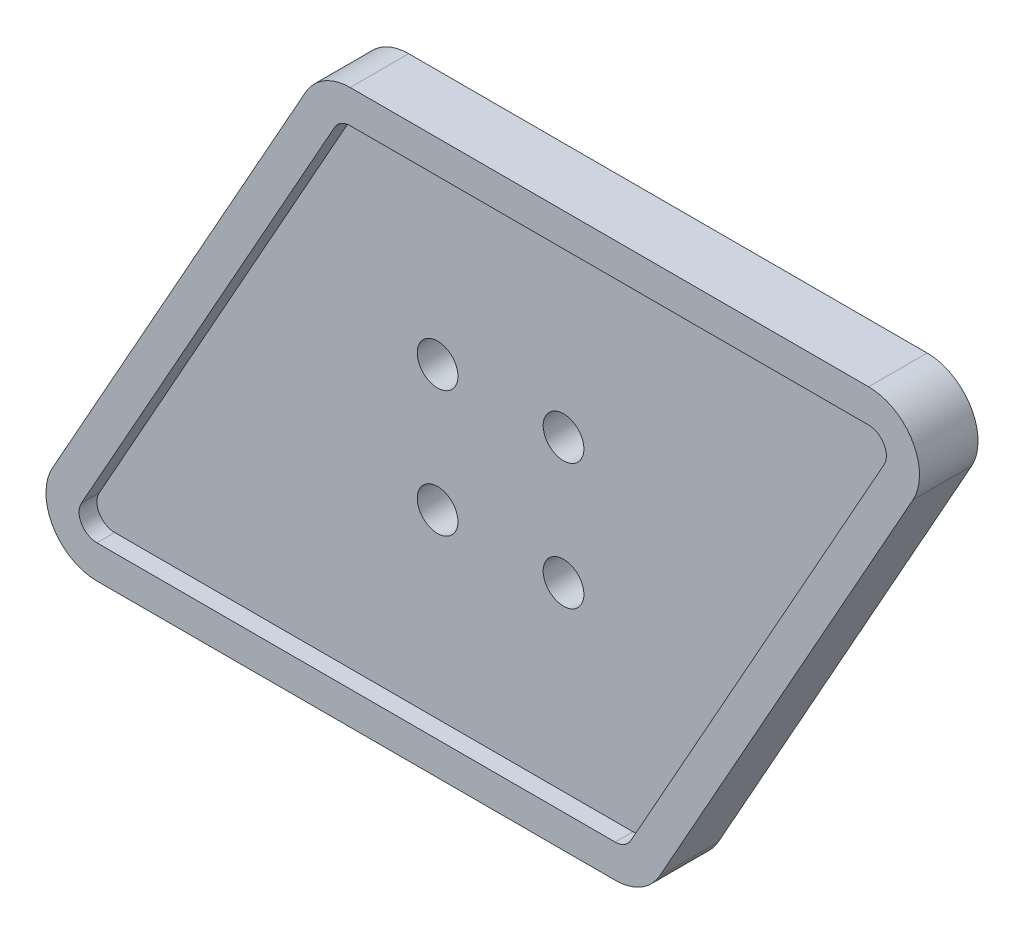
ISO-10303-21;
HEADER;
FILE_DESCRIPTION(('STEP AP214'),'2;1');
FILE_NAME('part.step','',(''),(''),'','','');
FILE_SCHEMA(('AUTOMOTIVE_DESIGN { 1 0 10303 214 1 1 1 1 }'));
ENDSEC;
DATA;
#1=APPLICATION_CONTEXT('core data for automotive mechanical design processes');
#2=APPLICATION_PROTOCOL_DEFINITION('international standard','automotive_design',2000,#1);
#3=PRODUCT_CONTEXT('',#1,'mechanical');
#4=PRODUCT('Part','Part','',(#3));
#5=PRODUCT_RELATED_PRODUCT_CATEGORY('part','',(#4));
#6=PRODUCT_DEFINITION_FORMATION('','',#4);
#7=PRODUCT_DEFINITION_CONTEXT('part definition',#1,'design');
#8=PRODUCT_DEFINITION('design','',#6,#7);
#9=PRODUCT_DEFINITION_SHAPE('','',#8);
#10=(LENGTH_UNIT() NAMED_UNIT(*) SI_UNIT(.MILLI.,.METRE.));
#11=(NAMED_UNIT(*) PLANE_ANGLE_UNIT() SI_UNIT($,.RADIAN.));
#12=(NAMED_UNIT(*) SI_UNIT($,.STERADIAN.) SOLID_ANGLE_UNIT());
#13=UNCERTAINTY_MEASURE_WITH_UNIT(LENGTH_MEASURE(1.E-05),#10,'distance_accuracy_value','');
#14=(GEOMETRIC_REPRESENTATION_CONTEXT(3) GLOBAL_UNCERTAINTY_ASSIGNED_CONTEXT((#13)) GLOBAL_UNIT_ASSIGNED_CONTEXT((#10,
#11,#12)) REPRESENTATION_CONTEXT('',''));
#15=CARTESIAN_POINT('',(0.,0.,0.));
#16=DIRECTION('',(0.,0.,1.));
#17=DIRECTION('',(1.,0.,0.));
#18=AXIS2_PLACEMENT_3D('',#15,#16,#17);
#19=CARTESIAN_POINT('',(-4.94974746830583,4.94974746830583,4.6));
#20=DIRECTION('',(0.,0.,-1.));
#21=DIRECTION('',(-1.,0.,0.));
#22=AXIS2_PLACEMENT_3D('',#19,#20,#21);
#23=CYLINDRICAL_SURFACE('',#22,1.6);
#24=CARTESIAN_POINT('',(-4.94974746830583,4.94974746830583,0.));
#25=DIRECTION('',(0.,0.,1.));
#26=DIRECTION('',(1.,0.,0.));
#27=AXIS2_PLACEMENT_3D('',#24,#25,#26);
#28=CIRCLE('',#27,1.6);
#29=CARTESIAN_POINT('',(-3.34974746830583,4.94974746830583,0.));
#30=VERTEX_POINT('',#29);
#31=EDGE_CURVE('E147',#30,#30,#28,.T.);
#32=ORIENTED_EDGE('',*,*,#31,.F.);
#33=EDGE_LOOP('',(#32));
#34=FACE_BOUND('',#33,.T.);
#35=CARTESIAN_POINT('',(-4.94974746830583,4.94974746830583,3.2));
#36=DIRECTION('',(0.,0.,1.));
#37=DIRECTION('',(1.,0.,0.));
#38=AXIS2_PLACEMENT_3D('',#35,#36,#37);
#39=CIRCLE('',#38,1.6);
#40=CARTESIAN_POINT('',(-3.34974746830583,4.94974746830583,3.2));
#41=VERTEX_POINT('',#40);
#42=EDGE_CURVE('E205',#41,#41,#39,.T.);
#43=ORIENTED_EDGE('',*,*,#42,.T.);
#44=EDGE_LOOP('',(#43));
#45=FACE_BOUND('',#44,.T.);
#46=ADVANCED_FACE('F33',(#34,#45),#23,.F.);
#47=CARTESIAN_POINT('',(4.94974746830583,4.94974746830583,4.6));
#48=DIRECTION('',(0.,0.,-1.));
#49=DIRECTION('',(-1.,0.,0.));
#50=AXIS2_PLACEMENT_3D('',#47,#48,#49);
#51=CYLINDRICAL_SURFACE('',#50,1.6);
#52=CARTESIAN_POINT('',(4.94974746830583,4.94974746830583,0.));
#53=DIRECTION('',(0.,0.,1.));
#54=DIRECTION('',(1.,0.,0.));
#55=AXIS2_PLACEMENT_3D('',#52,#53,#54);
#56=CIRCLE('',#55,1.6);
#57=CARTESIAN_POINT('',(6.54974746830583,4.94974746830583,0.));
#58=VERTEX_POINT('',#57);
#59=EDGE_CURVE('E196',#58,#58,#56,.T.);
#60=ORIENTED_EDGE('',*,*,#59,.F.);
#61=EDGE_LOOP('',(#60));
#62=FACE_BOUND('',#61,.T.);
#63=CARTESIAN_POINT('',(4.94974746830583,4.94974746830583,3.2));
#64=DIRECTION('',(0.,0.,1.));
#65=DIRECTION('',(1.,0.,0.));
#66=AXIS2_PLACEMENT_3D('',#63,#64,#65);
#67=CIRCLE('',#66,1.6);
#68=CARTESIAN_POINT('',(6.54974746830583,4.94974746830583,3.2));
#69=VERTEX_POINT('',#68);
#70=EDGE_CURVE('E208',#69,#69,#67,.T.);
#71=ORIENTED_EDGE('',*,*,#70,.T.);
#72=EDGE_LOOP('',(#71));
#73=FACE_BOUND('',#72,.T.);
#74=ADVANCED_FACE('F356',(#62,#73),#51,.F.);
#75=CARTESIAN_POINT('',(4.94974746830583,-4.94974746830583,4.6));
#76=DIRECTION('',(0.,0.,-1.));
#77=DIRECTION('',(-1.,0.,0.));
#78=AXIS2_PLACEMENT_3D('',#75,#76,#77);
#79=CYLINDRICAL_SURFACE('',#78,1.6);
#80=CARTESIAN_POINT('',(4.94974746830583,-4.94974746830583,0.));
#81=DIRECTION('',(0.,0.,1.));
#82=DIRECTION('',(1.,0.,0.));
#83=AXIS2_PLACEMENT_3D('',#80,#81,#82);
#84=CIRCLE('',#83,1.6);
#85=CARTESIAN_POINT('',(6.54974746830583,-4.94974746830583,0.));
#86=VERTEX_POINT('',#85);
#87=EDGE_CURVE('E199',#86,#86,#84,.T.);
#88=ORIENTED_EDGE('',*,*,#87,.F.);
#89=EDGE_LOOP('',(#88));
#90=FACE_BOUND('',#89,.T.);
#91=CARTESIAN_POINT('',(4.94974746830583,-4.94974746830583,3.2));
#92=DIRECTION('',(0.,0.,1.));
#93=DIRECTION('',(1.,0.,0.));
#94=AXIS2_PLACEMENT_3D('',#91,#92,#93);
#95=CIRCLE('',#94,1.6);
#96=CARTESIAN_POINT('',(6.54974746830583,-4.94974746830583,3.2));
#97=VERTEX_POINT('',#96);
#98=EDGE_CURVE('E211',#97,#97,#95,.T.);
#99=ORIENTED_EDGE('',*,*,#98,.T.);
#100=EDGE_LOOP('',(#99));
#101=FACE_BOUND('',#100,.T.);
#102=ADVANCED_FACE('F362',(#90,#101),#79,.F.);
#103=CARTESIAN_POINT('',(-4.94974746830583,-4.94974746830583,4.6));
#104=DIRECTION('',(0.,0.,-1.));
#105=DIRECTION('',(-1.,0.,0.));
#106=AXIS2_PLACEMENT_3D('',#103,#104,#105);
#107=CYLINDRICAL_SURFACE('',#106,1.6);
#108=CARTESIAN_POINT('',(-4.94974746830583,-4.94974746830583,0.));
#109=DIRECTION('',(0.,0.,1.));
#110=DIRECTION('',(1.,0.,0.));
#111=AXIS2_PLACEMENT_3D('',#108,#109,#110);
#112=CIRCLE('',#111,1.6);
#113=CARTESIAN_POINT('',(-3.34974746830583,-4.94974746830583,0.));
#114=VERTEX_POINT('',#113);
#115=EDGE_CURVE('E202',#114,#114,#112,.T.);
#116=ORIENTED_EDGE('',*,*,#115,.F.);
#117=EDGE_LOOP('',(#116));
#118=FACE_BOUND('',#117,.T.);
#119=CARTESIAN_POINT('',(-4.94974746830583,-4.94974746830583,3.2));
#120=DIRECTION('',(0.,0.,1.));
#121=DIRECTION('',(1.,0.,0.));
#122=AXIS2_PLACEMENT_3D('',#119,#120,#121);
#123=CIRCLE('',#122,1.6);
#124=CARTESIAN_POINT('',(-3.34974746830583,-4.94974746830583,3.2));
#125=VERTEX_POINT('',#124);
#126=EDGE_CURVE('E37',#125,#125,#123,.T.);
#127=ORIENTED_EDGE('',*,*,#126,.T.);
#128=EDGE_LOOP('',(#127));
#129=FACE_BOUND('',#128,.T.);
#130=ADVANCED_FACE('F371',(#118,#129),#107,.F.);
#131=CARTESIAN_POINT('',(10.4158751990318,-17.7727190896102,4.6));
#132=DIRECTION('',(0.,0.,-1.));
#133=DIRECTION('',(-1.,0.,0.));
#134=AXIS2_PLACEMENT_3D('',#131,#132,#133);
#135=PLANE('',#134);
#136=DIRECTION('',(0.488686699209131,0.872459345766944,0.));
#137=VECTOR('',#136,1.);
#138=CARTESIAN_POINT('',(11.6373182831056,-18.456880468503,4.6));
#139=LINE('',#138,#137);
#140=CARTESIAN_POINT('',(11.6373182831056,-18.456880468503,4.6));
#141=VERTEX_POINT('',#140);
#142=CARTESIAN_POINT('',(31.5472234724134,17.0885577107174,4.6));
#143=VERTEX_POINT('',#142);
#144=EDGE_CURVE('E256',#141,#143,#139,.T.);
#145=ORIENTED_EDGE('',*,*,#144,.F.);
#146=CARTESIAN_POINT('',(10.4158751990318,-17.7727190896102,4.6));
#147=DIRECTION('',(0.,0.,1.));
#148=DIRECTION('',(1.,0.,0.));
#149=AXIS2_PLACEMENT_3D('',#146,#147,#148);
#150=CIRCLE('',#149,1.40000000000001);
#151=CARTESIAN_POINT('',(10.4158751990318,-19.1727190896102,4.6));
#152=VERTEX_POINT('',#151);
#153=EDGE_CURVE('E49',#152,#141,#150,.T.);
#154=ORIENTED_EDGE('',*,*,#153,.F.);
#155=DIRECTION('',(1.,0.,0.));
#156=VECTOR('',#155,1.);
#157=CARTESIAN_POINT('',(-30.3257803883397,-19.1727190896102,4.6));
#158=LINE('',#157,#156);
#159=CARTESIAN_POINT('',(-30.3257803883397,-19.1727190896102,4.6));
#160=VERTEX_POINT('',#159);
#161=EDGE_CURVE('E237',#160,#152,#158,.T.);
#162=ORIENTED_EDGE('',*,*,#161,.F.);
#163=CARTESIAN_POINT('',(-30.3257803883397,-17.7727190896102,4.6));
#164=DIRECTION('',(0.,0.,1.));
#165=DIRECTION('',(1.,0.,0.));
#166=AXIS2_PLACEMENT_3D('',#163,#164,#165);
#167=CIRCLE('',#166,1.40000000000003);
#168=CARTESIAN_POINT('',(-31.5472234724134,-17.0885577107174,4.6));
#169=VERTEX_POINT('',#168);
#170=EDGE_CURVE('E241',#169,#160,#167,.T.);
#171=ORIENTED_EDGE('',*,*,#170,.F.);
#172=DIRECTION('',(-0.488686699209131,-0.872459345766944,0.));
#173=VECTOR('',#172,1.);
#174=CARTESIAN_POINT('',(-11.6373182831056,18.4568804685029,4.6));
#175=LINE('',#174,#173);
#176=CARTESIAN_POINT('',(-11.6373182831056,18.4568804685029,4.6));
#177=VERTEX_POINT('',#176);
#178=EDGE_CURVE('E244',#177,#169,#175,.T.);
#179=ORIENTED_EDGE('',*,*,#178,.F.);
#180=CARTESIAN_POINT('',(-10.4158751990318,17.7727190896102,4.6));
#181=DIRECTION('',(0.,0.,1.));
#182=DIRECTION('',(1.,0.,0.));
#183=AXIS2_PLACEMENT_3D('',#180,#181,#182);
#184=CIRCLE('',#183,1.40000000000001);
#185=CARTESIAN_POINT('',(-10.4158751990319,19.1727190896102,4.6));
#186=VERTEX_POINT('',#185);
#187=EDGE_CURVE('E247',#186,#177,#184,.T.);
#188=ORIENTED_EDGE('',*,*,#187,.F.);
#189=DIRECTION('',(-1.,0.,0.));
#190=VECTOR('',#189,1.);
#191=CARTESIAN_POINT('',(30.3257803883397,19.1727190896102,4.6));
#192=LINE('',#191,#190);
#193=CARTESIAN_POINT('',(30.3257803883397,19.1727190896102,4.6));
#194=VERTEX_POINT('',#193);
#195=EDGE_CURVE('E250',#194,#186,#192,.T.);
#196=ORIENTED_EDGE('',*,*,#195,.F.);
#197=CARTESIAN_POINT('',(30.3257803883396,17.7727190896101,4.6));
#198=DIRECTION('',(0.,0.,1.));
#199=DIRECTION('',(1.,0.,0.));
#200=AXIS2_PLACEMENT_3D('',#197,#198,#199);
#201=CIRCLE('',#200,1.40000000000003);
#202=EDGE_CURVE('E253',#143,#194,#201,.T.);
#203=ORIENTED_EDGE('',*,*,#202,.F.);
#204=EDGE_LOOP('',(#145,#154,#162,#171,#179,#188,#196,#203));
#205=FACE_BOUND('',#204,.T.);
#206=CARTESIAN_POINT('',(10.4158751990318,-17.7727190896102,4.6));
#207=DIRECTION('',(0.,0.,1.));
#208=DIRECTION('',(-1.,0.,0.));
#209=AXIS2_PLACEMENT_3D('',#206,#207,#208);
#210=CIRCLE('',#209,4.00000000000001);
#211=CARTESIAN_POINT('',(10.4158751990318,-21.7727190896102,4.6));
#212=VERTEX_POINT('',#211);
#213=CARTESIAN_POINT('',(13.9057125820996,-19.7274658864467,4.6));
#214=VERTEX_POINT('',#213);
#215=EDGE_CURVE('E159',#212,#214,#210,.T.);
#216=ORIENTED_EDGE('',*,*,#215,.T.);
#217=DIRECTION('',(0.488686699209131,0.872459345766944,0.));
#218=VECTOR('',#217,1.);
#219=CARTESIAN_POINT('',(33.8156177714075,15.8179722927736,4.6));
#220=LINE('',#219,#218);
#221=CARTESIAN_POINT('',(33.8156177714075,15.8179722927736,4.6));
#222=VERTEX_POINT('',#221);
#223=EDGE_CURVE('E99',#214,#222,#220,.T.);
#224=ORIENTED_EDGE('',*,*,#223,.T.);
#225=CARTESIAN_POINT('',(30.3257803883396,17.7727190896101,4.6));
#226=DIRECTION('',(0.,0.,1.));
#227=DIRECTION('',(-1.,0.,0.));
#228=AXIS2_PLACEMENT_3D('',#225,#226,#227);
#229=CIRCLE('',#228,4.00000000000003);
#230=CARTESIAN_POINT('',(30.3257803883397,21.7727190896102,4.6));
#231=VERTEX_POINT('',#230);
#232=EDGE_CURVE('E175',#222,#231,#229,.T.);
#233=ORIENTED_EDGE('',*,*,#232,.T.);
#234=DIRECTION('',(-1.,0.,0.));
#235=VECTOR('',#234,1.);
#236=CARTESIAN_POINT('',(-10.4158751990318,21.7727190896102,4.6));
#237=LINE('',#236,#235);
#238=CARTESIAN_POINT('',(-10.4158751990318,21.7727190896102,4.6));
#239=VERTEX_POINT('',#238);
#240=EDGE_CURVE('E188',#231,#239,#237,.T.);
#241=ORIENTED_EDGE('',*,*,#240,.T.);
#242=CARTESIAN_POINT('',(-10.4158751990318,17.7727190896102,4.6));
#243=DIRECTION('',(0.,0.,1.));
#244=DIRECTION('',(-1.,0.,0.));
#245=AXIS2_PLACEMENT_3D('',#242,#243,#244);
#246=CIRCLE('',#245,4.00000000000001);
#247=CARTESIAN_POINT('',(-13.9057125820996,19.7274658864467,4.6));
#248=VERTEX_POINT('',#247);
#249=EDGE_CURVE('E122',#239,#248,#246,.T.);
#250=ORIENTED_EDGE('',*,*,#249,.T.);
#251=DIRECTION('',(-0.488686699209131,-0.872459345766944,0.));
#252=VECTOR('',#251,1.);
#253=CARTESIAN_POINT('',(-33.8156177714075,-15.8179722927736,4.6));
#254=LINE('',#253,#252);
#255=CARTESIAN_POINT('',(-33.8156177714075,-15.8179722927736,4.6));
#256=VERTEX_POINT('',#255);
#257=EDGE_CURVE('E115',#248,#256,#254,.T.);
#258=ORIENTED_EDGE('',*,*,#257,.T.);
#259=CARTESIAN_POINT('',(-30.3257803883397,-17.7727190896102,4.6));
#260=DIRECTION('',(0.,0.,1.));
#261=DIRECTION('',(1.,0.,0.));
#262=AXIS2_PLACEMENT_3D('',#259,#260,#261);
#263=CIRCLE('',#262,4.00000000000003);
#264=CARTESIAN_POINT('',(-30.3257803883397,-21.7727190896102,4.6));
#265=VERTEX_POINT('',#264);
#266=EDGE_CURVE('E119',#256,#265,#263,.T.);
#267=ORIENTED_EDGE('',*,*,#266,.T.);
#268=DIRECTION('',(1.,0.,0.));
#269=VECTOR('',#268,1.);
#270=CARTESIAN_POINT('',(10.4158751990318,-21.7727190896102,4.6));
#271=LINE('',#270,#269);
#272=EDGE_CURVE('E58',#265,#212,#271,.T.);
#273=ORIENTED_EDGE('',*,*,#272,.T.);
#274=EDGE_LOOP('',(#216,#224,#233,#241,#250,#258,#267,#273));
#275=FACE_BOUND('',#274,.T.);
#276=ADVANCED_FACE('F117',(#205,#275),#135,.F.);
#277=CARTESIAN_POINT('',(10.4158751990318,-17.7727190896102,0.));
#278=DIRECTION('',(0.,0.,-1.));
#279=DIRECTION('',(-1.,0.,0.));
#280=AXIS2_PLACEMENT_3D('',#277,#278,#279);
#281=PLANE('',#280);
#282=ORIENTED_EDGE('',*,*,#87,.T.);
#283=EDGE_LOOP('',(#282));
#284=FACE_BOUND('',#283,.T.);
#285=ORIENTED_EDGE('',*,*,#31,.T.);
#286=EDGE_LOOP('',(#285));
#287=FACE_BOUND('',#286,.T.);
#288=CARTESIAN_POINT('',(10.4158751990318,-17.7727190896102,0.));
#289=DIRECTION('',(0.,0.,1.));
#290=DIRECTION('',(-1.,0.,0.));
#291=AXIS2_PLACEMENT_3D('',#288,#289,#290);
#292=CIRCLE('',#291,4.00000000000001);
#293=CARTESIAN_POINT('',(10.4158751990318,-21.7727190896102,0.));
#294=VERTEX_POINT('',#293);
#295=CARTESIAN_POINT('',(13.9057125820996,-19.7274658864467,0.));
#296=VERTEX_POINT('',#295);
#297=EDGE_CURVE('E143',#294,#296,#292,.T.);
#298=ORIENTED_EDGE('',*,*,#297,.F.);
#299=DIRECTION('',(1.,0.,0.));
#300=VECTOR('',#299,1.);
#301=CARTESIAN_POINT('',(10.4158751990318,-21.7727190896102,0.));
#302=LINE('',#301,#300);
#303=CARTESIAN_POINT('',(-30.3257803883397,-21.7727190896102,0.));
#304=VERTEX_POINT('',#303);
#305=EDGE_CURVE('E91',#304,#294,#302,.T.);
#306=ORIENTED_EDGE('',*,*,#305,.F.);
#307=CARTESIAN_POINT('',(-30.3257803883397,-17.7727190896102,0.));
#308=DIRECTION('',(0.,0.,1.));
#309=DIRECTION('',(1.,0.,0.));
#310=AXIS2_PLACEMENT_3D('',#307,#308,#309);
#311=CIRCLE('',#310,4.00000000000003);
#312=CARTESIAN_POINT('',(-33.8156177714075,-15.8179722927736,0.));
#313=VERTEX_POINT('',#312);
#314=EDGE_CURVE('E156',#313,#304,#311,.T.);
#315=ORIENTED_EDGE('',*,*,#314,.F.);
#316=DIRECTION('',(-0.488686699209131,-0.872459345766944,0.));
#317=VECTOR('',#316,1.);
#318=CARTESIAN_POINT('',(-33.8156177714075,-15.8179722927736,0.));
#319=LINE('',#318,#317);
#320=CARTESIAN_POINT('',(-13.9057125820996,19.7274658864467,0.));
#321=VERTEX_POINT('',#320);
#322=EDGE_CURVE('E131',#321,#313,#319,.T.);
#323=ORIENTED_EDGE('',*,*,#322,.F.);
#324=CARTESIAN_POINT('',(-10.4158751990318,17.7727190896102,0.));
#325=DIRECTION('',(0.,0.,1.));
#326=DIRECTION('',(-1.,0.,0.));
#327=AXIS2_PLACEMENT_3D('',#324,#325,#326);
#328=CIRCLE('',#327,4.00000000000001);
#329=CARTESIAN_POINT('',(-10.4158751990318,21.7727190896102,0.));
#330=VERTEX_POINT('',#329);
#331=EDGE_CURVE('E153',#330,#321,#328,.T.);
#332=ORIENTED_EDGE('',*,*,#331,.F.);
#333=DIRECTION('',(-1.,0.,0.));
#334=VECTOR('',#333,1.);
#335=CARTESIAN_POINT('',(-10.4158751990318,21.7727190896102,0.));
#336=LINE('',#335,#334);
#337=CARTESIAN_POINT('',(30.3257803883397,21.7727190896102,0.));
#338=VERTEX_POINT('',#337);
#339=EDGE_CURVE('E151',#338,#330,#336,.T.);
#340=ORIENTED_EDGE('',*,*,#339,.F.);
#341=CARTESIAN_POINT('',(30.3257803883396,17.7727190896101,0.));
#342=DIRECTION('',(0.,0.,1.));
#343=DIRECTION('',(-1.,0.,0.));
#344=AXIS2_PLACEMENT_3D('',#341,#342,#343);
#345=CIRCLE('',#344,4.00000000000003);
#346=CARTESIAN_POINT('',(33.8156177714075,15.8179722927736,0.));
#347=VERTEX_POINT('',#346);
#348=EDGE_CURVE('E149',#347,#338,#345,.T.);
#349=ORIENTED_EDGE('',*,*,#348,.F.);
#350=DIRECTION('',(0.488686699209131,0.872459345766944,0.));
#351=VECTOR('',#350,1.);
#352=CARTESIAN_POINT('',(33.8156177714075,15.8179722927736,0.));
#353=LINE('',#352,#351);
#354=EDGE_CURVE('E146',#296,#347,#353,.T.);
#355=ORIENTED_EDGE('',*,*,#354,.F.);
#356=EDGE_LOOP('',(#298,#306,#315,#323,#332,#340,#349,#355));
#357=FACE_BOUND('',#356,.T.);
#358=ORIENTED_EDGE('',*,*,#59,.T.);
#359=EDGE_LOOP('',(#358));
#360=FACE_BOUND('',#359,.T.);
#361=ORIENTED_EDGE('',*,*,#115,.T.);
#362=EDGE_LOOP('',(#361));
#363=FACE_BOUND('',#362,.T.);
#364=ADVANCED_FACE('F179',(#284,#287,#357,#360,#363),#281,.T.);
#365=CARTESIAN_POINT('',(10.4158751990318,-17.7727190896102,4.6));
#366=DIRECTION('',(0.,0.,-1.));
#367=DIRECTION('',(-1.,0.,0.));
#368=AXIS2_PLACEMENT_3D('',#365,#366,#367);
#369=CYLINDRICAL_SURFACE('',#368,4.00000000000001);
#370=ORIENTED_EDGE('',*,*,#297,.T.);
#371=DIRECTION('',(0.,0.,-1.));
#372=VECTOR('',#371,1.);
#373=CARTESIAN_POINT('',(13.9057125820996,-19.7274658864467,4.6));
#374=LINE('',#373,#372);
#375=EDGE_CURVE('E11',#214,#296,#374,.T.);
#376=ORIENTED_EDGE('',*,*,#375,.F.);
#377=ORIENTED_EDGE('',*,*,#215,.F.);
#378=DIRECTION('',(0.,0.,-1.));
#379=VECTOR('',#378,1.);
#380=CARTESIAN_POINT('',(10.4158751990318,-21.7727190896102,4.6));
#381=LINE('',#380,#379);
#382=EDGE_CURVE('E139',#212,#294,#381,.T.);
#383=ORIENTED_EDGE('',*,*,#382,.T.);
#384=EDGE_LOOP('',(#370,#376,#377,#383));
#385=FACE_BOUND('',#384,.T.);
#386=ADVANCED_FACE('F35',(#385),#369,.T.);
#387=CARTESIAN_POINT('',(33.8156177714075,15.8179722927736,4.6));
#388=DIRECTION('',(-0.872459345766944,0.488686699209131,0.));
#389=DIRECTION('',(-0.488686699209131,-0.872459345766944,0.));
#390=AXIS2_PLACEMENT_3D('',#387,#388,#389);
#391=PLANE('',#390);
#392=ORIENTED_EDGE('',*,*,#354,.T.);
#393=DIRECTION('',(0.,0.,-1.));
#394=VECTOR('',#393,1.);
#395=CARTESIAN_POINT('',(33.8156177714075,15.8179722927736,4.6));
#396=LINE('',#395,#394);
#397=EDGE_CURVE('E42',#222,#347,#396,.T.);
#398=ORIENTED_EDGE('',*,*,#397,.F.);
#399=ORIENTED_EDGE('',*,*,#223,.F.);
#400=ORIENTED_EDGE('',*,*,#375,.T.);
#401=EDGE_LOOP('',(#392,#398,#399,#400));
#402=FACE_BOUND('',#401,.T.);
#403=ADVANCED_FACE('F387',(#402),#391,.F.);
#404=CARTESIAN_POINT('',(30.3257803883396,17.7727190896101,4.6));
#405=DIRECTION('',(0.,0.,-1.));
#406=DIRECTION('',(-1.,0.,0.));
#407=AXIS2_PLACEMENT_3D('',#404,#405,#406);
#408=CYLINDRICAL_SURFACE('',#407,4.00000000000003);
#409=ORIENTED_EDGE('',*,*,#348,.T.);
#410=DIRECTION('',(0.,0.,-1.));
#411=VECTOR('',#410,1.);
#412=CARTESIAN_POINT('',(30.3257803883397,21.7727190896102,4.6));
#413=LINE('',#412,#411);
#414=EDGE_CURVE('E166',#231,#338,#413,.T.);
#415=ORIENTED_EDGE('',*,*,#414,.F.);
#416=ORIENTED_EDGE('',*,*,#232,.F.);
#417=ORIENTED_EDGE('',*,*,#397,.T.);
#418=EDGE_LOOP('',(#409,#415,#416,#417));
#419=FACE_BOUND('',#418,.T.);
#420=ADVANCED_FACE('F173',(#419),#408,.T.);
#421=CARTESIAN_POINT('',(-10.4158751990318,21.7727190896102,4.6));
#422=DIRECTION('',(0.,-1.,0.));
#423=DIRECTION('',(1.,0.,0.));
#424=AXIS2_PLACEMENT_3D('',#421,#422,#423);
#425=PLANE('',#424);
#426=ORIENTED_EDGE('',*,*,#339,.T.);
#427=DIRECTION('',(0.,0.,-1.));
#428=VECTOR('',#427,1.);
#429=CARTESIAN_POINT('',(-10.4158751990318,21.7727190896102,4.6));
#430=LINE('',#429,#428);
#431=EDGE_CURVE('E163',#239,#330,#430,.T.);
#432=ORIENTED_EDGE('',*,*,#431,.F.);
#433=ORIENTED_EDGE('',*,*,#240,.F.);
#434=ORIENTED_EDGE('',*,*,#414,.T.);
#435=EDGE_LOOP('',(#426,#432,#433,#434));
#436=FACE_BOUND('',#435,.T.);
#437=ADVANCED_FACE('F184',(#436),#425,.F.);
#438=CARTESIAN_POINT('',(-10.4158751990318,17.7727190896102,4.6));
#439=DIRECTION('',(0.,0.,-1.));
#440=DIRECTION('',(-1.,0.,0.));
#441=AXIS2_PLACEMENT_3D('',#438,#439,#440);
#442=CYLINDRICAL_SURFACE('',#441,4.00000000000001);
#443=ORIENTED_EDGE('',*,*,#331,.T.);
#444=DIRECTION('',(0.,0.,-1.));
#445=VECTOR('',#444,1.);
#446=CARTESIAN_POINT('',(-13.9057125820996,19.7274658864467,4.6));
#447=LINE('',#446,#445);
#448=EDGE_CURVE('E134',#248,#321,#447,.T.);
#449=ORIENTED_EDGE('',*,*,#448,.F.);
#450=ORIENTED_EDGE('',*,*,#249,.F.);
#451=ORIENTED_EDGE('',*,*,#431,.T.);
#452=EDGE_LOOP('',(#443,#449,#450,#451));
#453=FACE_BOUND('',#452,.T.);
#454=ADVANCED_FACE('F187',(#453),#442,.T.);
#455=CARTESIAN_POINT('',(-33.8156177714075,-15.8179722927736,4.6));
#456=DIRECTION('',(0.872459345766944,-0.488686699209131,0.));
#457=DIRECTION('',(0.488686699209131,0.872459345766944,0.));
#458=AXIS2_PLACEMENT_3D('',#455,#456,#457);
#459=PLANE('',#458);
#460=ORIENTED_EDGE('',*,*,#322,.T.);
#461=DIRECTION('',(0.,0.,-1.));
#462=VECTOR('',#461,1.);
#463=CARTESIAN_POINT('',(-33.8156177714075,-15.8179722927736,4.6));
#464=LINE('',#463,#462);
#465=EDGE_CURVE('E128',#256,#313,#464,.T.);
#466=ORIENTED_EDGE('',*,*,#465,.F.);
#467=ORIENTED_EDGE('',*,*,#257,.F.);
#468=ORIENTED_EDGE('',*,*,#448,.T.);
#469=EDGE_LOOP('',(#460,#466,#467,#468));
#470=FACE_BOUND('',#469,.T.);
#471=ADVANCED_FACE('F129',(#470),#459,.F.);
#472=CARTESIAN_POINT('',(-30.3257803883397,-17.7727190896102,4.6));
#473=DIRECTION('',(0.,0.,-1.));
#474=DIRECTION('',(-1.,0.,0.));
#475=AXIS2_PLACEMENT_3D('',#472,#473,#474);
#476=CYLINDRICAL_SURFACE('',#475,4.00000000000003);
#477=ORIENTED_EDGE('',*,*,#314,.T.);
#478=DIRECTION('',(0.,0.,-1.));
#479=VECTOR('',#478,1.);
#480=CARTESIAN_POINT('',(-30.3257803883397,-21.7727190896102,4.6));
#481=LINE('',#480,#479);
#482=EDGE_CURVE('E135',#265,#304,#481,.T.);
#483=ORIENTED_EDGE('',*,*,#482,.F.);
#484=ORIENTED_EDGE('',*,*,#266,.F.);
#485=ORIENTED_EDGE('',*,*,#465,.T.);
#486=EDGE_LOOP('',(#477,#483,#484,#485));
#487=FACE_BOUND('',#486,.T.);
#488=ADVANCED_FACE('F137',(#487),#476,.T.);
#489=CARTESIAN_POINT('',(10.4158751990318,-21.7727190896102,4.6));
#490=DIRECTION('',(0.,1.,0.));
#491=DIRECTION('',(-1.,0.,0.));
#492=AXIS2_PLACEMENT_3D('',#489,#490,#491);
#493=PLANE('',#492);
#494=ORIENTED_EDGE('',*,*,#305,.T.);
#495=ORIENTED_EDGE('',*,*,#382,.F.);
#496=ORIENTED_EDGE('',*,*,#272,.F.);
#497=ORIENTED_EDGE('',*,*,#482,.T.);
#498=EDGE_LOOP('',(#494,#495,#496,#497));
#499=FACE_BOUND('',#498,.T.);
#500=ADVANCED_FACE('F375',(#499),#493,.F.);
#501=CARTESIAN_POINT('',(10.4158751990318,-17.7727190896102,3.2));
#502=DIRECTION('',(0.,0.,1.));
#503=DIRECTION('',(1.,0.,0.));
#504=AXIS2_PLACEMENT_3D('',#501,#502,#503);
#505=CYLINDRICAL_SURFACE('',#504,1.40000000000001);
#506=ORIENTED_EDGE('',*,*,#153,.T.);
#507=DIRECTION('',(0.,0.,1.));
#508=VECTOR('',#507,1.);
#509=CARTESIAN_POINT('',(11.6373182831056,-18.456880468503,3.2));
#510=LINE('',#509,#508);
#511=CARTESIAN_POINT('',(11.6373182831056,-18.456880468503,3.2));
#512=VERTEX_POINT('',#511);
#513=EDGE_CURVE('E214',#512,#141,#510,.T.);
#514=ORIENTED_EDGE('',*,*,#513,.F.);
#515=CARTESIAN_POINT('',(10.4158751990318,-17.7727190896102,3.2));
#516=DIRECTION('',(0.,0.,1.));
#517=DIRECTION('',(1.,0.,0.));
#518=AXIS2_PLACEMENT_3D('',#515,#516,#517);
#519=CIRCLE('',#518,1.40000000000001);
#520=CARTESIAN_POINT('',(10.4158751990318,-19.1727190896102,3.2));
#521=VERTEX_POINT('',#520);
#522=EDGE_CURVE('E240',#521,#512,#519,.T.);
#523=ORIENTED_EDGE('',*,*,#522,.F.);
#524=DIRECTION('',(0.,0.,1.));
#525=VECTOR('',#524,1.);
#526=CARTESIAN_POINT('',(10.4158751990318,-19.1727190896102,3.2));
#527=LINE('',#526,#525);
#528=EDGE_CURVE('E235',#521,#152,#527,.T.);
#529=ORIENTED_EDGE('',*,*,#528,.T.);
#530=EDGE_LOOP('',(#506,#514,#523,#529));
#531=FACE_BOUND('',#530,.T.);
#532=ADVANCED_FACE('F289',(#531),#505,.F.);
#533=CARTESIAN_POINT('',(-30.3257803883397,-19.1727190896102,3.2));
#534=DIRECTION('',(0.,-1.,0.));
#535=DIRECTION('',(1.,0.,0.));
#536=AXIS2_PLACEMENT_3D('',#533,#534,#535);
#537=PLANE('',#536);
#538=ORIENTED_EDGE('',*,*,#161,.T.);
#539=ORIENTED_EDGE('',*,*,#528,.F.);
#540=DIRECTION('',(1.,0.,0.));
#541=VECTOR('',#540,1.);
#542=CARTESIAN_POINT('',(-30.3257803883397,-19.1727190896102,3.2));
#543=LINE('',#542,#541);
#544=CARTESIAN_POINT('',(-30.3257803883397,-19.1727190896102,3.2));
#545=VERTEX_POINT('',#544);
#546=EDGE_CURVE('E217',#545,#521,#543,.T.);
#547=ORIENTED_EDGE('',*,*,#546,.F.);
#548=DIRECTION('',(0.,0.,1.));
#549=VECTOR('',#548,1.);
#550=CARTESIAN_POINT('',(-30.3257803883397,-19.1727190896102,3.2));
#551=LINE('',#550,#549);
#552=EDGE_CURVE('E232',#545,#160,#551,.T.);
#553=ORIENTED_EDGE('',*,*,#552,.T.);
#554=EDGE_LOOP('',(#538,#539,#547,#553));
#555=FACE_BOUND('',#554,.T.);
#556=ADVANCED_FACE('F309',(#555),#537,.F.);
#557=CARTESIAN_POINT('',(-30.3257803883397,-17.7727190896102,3.2));
#558=DIRECTION('',(0.,0.,1.));
#559=DIRECTION('',(1.,0.,0.));
#560=AXIS2_PLACEMENT_3D('',#557,#558,#559);
#561=CYLINDRICAL_SURFACE('',#560,1.40000000000003);
#562=ORIENTED_EDGE('',*,*,#170,.T.);
#563=ORIENTED_EDGE('',*,*,#552,.F.);
#564=CARTESIAN_POINT('',(-30.3257803883397,-17.7727190896102,3.2));
#565=DIRECTION('',(0.,0.,1.));
#566=DIRECTION('',(1.,0.,0.));
#567=AXIS2_PLACEMENT_3D('',#564,#565,#566);
#568=CIRCLE('',#567,1.40000000000003);
#569=CARTESIAN_POINT('',(-31.5472234724134,-17.0885577107174,3.2));
#570=VERTEX_POINT('',#569);
#571=EDGE_CURVE('E262',#570,#545,#568,.T.);
#572=ORIENTED_EDGE('',*,*,#571,.F.);
#573=DIRECTION('',(0.,0.,1.));
#574=VECTOR('',#573,1.);
#575=CARTESIAN_POINT('',(-31.5472234724134,-17.0885577107174,3.2));
#576=LINE('',#575,#574);
#577=EDGE_CURVE('E229',#570,#169,#576,.T.);
#578=ORIENTED_EDGE('',*,*,#577,.T.);
#579=EDGE_LOOP('',(#562,#563,#572,#578));
#580=FACE_BOUND('',#579,.T.);
#581=ADVANCED_FACE('F314',(#580),#561,.F.);
#582=CARTESIAN_POINT('',(-11.6373182831056,18.4568804685029,3.2));
#583=DIRECTION('',(-0.872459345766944,0.488686699209131,0.));
#584=DIRECTION('',(-0.488686699209131,-0.872459345766944,0.));
#585=AXIS2_PLACEMENT_3D('',#582,#583,#584);
#586=PLANE('',#585);
#587=ORIENTED_EDGE('',*,*,#178,.T.);
#588=ORIENTED_EDGE('',*,*,#577,.F.);
#589=DIRECTION('',(-0.488686699209131,-0.872459345766944,0.));
#590=VECTOR('',#589,1.);
#591=CARTESIAN_POINT('',(-11.6373182831056,18.4568804685029,3.2));
#592=LINE('',#591,#590);
#593=CARTESIAN_POINT('',(-11.6373182831056,18.4568804685029,3.2));
#594=VERTEX_POINT('',#593);
#595=EDGE_CURVE('E265',#594,#570,#592,.T.);
#596=ORIENTED_EDGE('',*,*,#595,.F.);
#597=DIRECTION('',(0.,0.,1.));
#598=VECTOR('',#597,1.);
#599=CARTESIAN_POINT('',(-11.6373182831056,18.4568804685029,3.2));
#600=LINE('',#599,#598);
#601=EDGE_CURVE('E226',#594,#177,#600,.T.);
#602=ORIENTED_EDGE('',*,*,#601,.T.);
#603=EDGE_LOOP('',(#587,#588,#596,#602));
#604=FACE_BOUND('',#603,.T.);
#605=ADVANCED_FACE('F340',(#604),#586,.F.);
#606=CARTESIAN_POINT('',(-10.4158751990318,17.7727190896102,3.2));
#607=DIRECTION('',(0.,0.,1.));
#608=DIRECTION('',(1.,0.,0.));
#609=AXIS2_PLACEMENT_3D('',#606,#607,#608);
#610=CYLINDRICAL_SURFACE('',#609,1.40000000000001);
#611=ORIENTED_EDGE('',*,*,#187,.T.);
#612=ORIENTED_EDGE('',*,*,#601,.F.);
#613=CARTESIAN_POINT('',(-10.4158751990318,17.7727190896102,3.2));
#614=DIRECTION('',(0.,0.,1.));
#615=DIRECTION('',(1.,0.,0.));
#616=AXIS2_PLACEMENT_3D('',#613,#614,#615);
#617=CIRCLE('',#616,1.40000000000001);
#618=CARTESIAN_POINT('',(-10.4158751990319,19.1727190896102,3.2));
#619=VERTEX_POINT('',#618);
#620=EDGE_CURVE('E268',#619,#594,#617,.T.);
#621=ORIENTED_EDGE('',*,*,#620,.F.);
#622=DIRECTION('',(0.,0.,1.));
#623=VECTOR('',#622,1.);
#624=CARTESIAN_POINT('',(-10.4158751990319,19.1727190896102,3.2));
#625=LINE('',#624,#623);
#626=EDGE_CURVE('E223',#619,#186,#625,.T.);
#627=ORIENTED_EDGE('',*,*,#626,.T.);
#628=EDGE_LOOP('',(#611,#612,#621,#627));
#629=FACE_BOUND('',#628,.T.);
#630=ADVANCED_FACE('F343',(#629),#610,.F.);
#631=CARTESIAN_POINT('',(30.3257803883397,19.1727190896102,3.2));
#632=DIRECTION('',(0.,1.,0.));
#633=DIRECTION('',(-1.,0.,0.));
#634=AXIS2_PLACEMENT_3D('',#631,#632,#633);
#635=PLANE('',#634);
#636=ORIENTED_EDGE('',*,*,#195,.T.);
#637=ORIENTED_EDGE('',*,*,#626,.F.);
#638=DIRECTION('',(-1.,0.,0.));
#639=VECTOR('',#638,1.);
#640=CARTESIAN_POINT('',(30.3257803883397,19.1727190896102,3.2));
#641=LINE('',#640,#639);
#642=CARTESIAN_POINT('',(30.3257803883397,19.1727190896102,3.2));
#643=VERTEX_POINT('',#642);
#644=EDGE_CURVE('E271',#643,#619,#641,.T.);
#645=ORIENTED_EDGE('',*,*,#644,.F.);
#646=DIRECTION('',(0.,0.,1.));
#647=VECTOR('',#646,1.);
#648=CARTESIAN_POINT('',(30.3257803883397,19.1727190896102,3.2));
#649=LINE('',#648,#647);
#650=EDGE_CURVE('E220',#643,#194,#649,.T.);
#651=ORIENTED_EDGE('',*,*,#650,.T.);
#652=EDGE_LOOP('',(#636,#637,#645,#651));
#653=FACE_BOUND('',#652,.T.);
#654=ADVANCED_FACE('F346',(#653),#635,.F.);
#655=CARTESIAN_POINT('',(30.3257803883396,17.7727190896101,3.2));
#656=DIRECTION('',(0.,0.,1.));
#657=DIRECTION('',(1.,0.,0.));
#658=AXIS2_PLACEMENT_3D('',#655,#656,#657);
#659=CYLINDRICAL_SURFACE('',#658,1.40000000000003);
#660=ORIENTED_EDGE('',*,*,#202,.T.);
#661=ORIENTED_EDGE('',*,*,#650,.F.);
#662=CARTESIAN_POINT('',(30.3257803883396,17.7727190896101,3.2));
#663=DIRECTION('',(0.,0.,1.));
#664=DIRECTION('',(1.,0.,0.));
#665=AXIS2_PLACEMENT_3D('',#662,#663,#664);
#666=CIRCLE('',#665,1.40000000000003);
#667=CARTESIAN_POINT('',(31.5472234724134,17.0885577107174,3.2));
#668=VERTEX_POINT('',#667);
#669=EDGE_CURVE('E274',#668,#643,#666,.T.);
#670=ORIENTED_EDGE('',*,*,#669,.F.);
#671=DIRECTION('',(0.,0.,1.));
#672=VECTOR('',#671,1.);
#673=CARTESIAN_POINT('',(31.5472234724134,17.0885577107174,3.2));
#674=LINE('',#673,#672);
#675=EDGE_CURVE('E216',#668,#143,#674,.T.);
#676=ORIENTED_EDGE('',*,*,#675,.T.);
#677=EDGE_LOOP('',(#660,#661,#670,#676));
#678=FACE_BOUND('',#677,.T.);
#679=ADVANCED_FACE('F329',(#678),#659,.F.);
#680=CARTESIAN_POINT('',(11.6373182831056,-18.456880468503,3.2));
#681=DIRECTION('',(0.872459345766944,-0.488686699209131,0.));
#682=DIRECTION('',(0.488686699209131,0.872459345766944,0.));
#683=AXIS2_PLACEMENT_3D('',#680,#681,#682);
#684=PLANE('',#683);
#685=ORIENTED_EDGE('',*,*,#144,.T.);
#686=ORIENTED_EDGE('',*,*,#675,.F.);
#687=DIRECTION('',(0.488686699209131,0.872459345766944,0.));
#688=VECTOR('',#687,1.);
#689=CARTESIAN_POINT('',(11.6373182831056,-18.456880468503,3.2));
#690=LINE('',#689,#688);
#691=EDGE_CURVE('E277',#512,#668,#690,.T.);
#692=ORIENTED_EDGE('',*,*,#691,.F.);
#693=ORIENTED_EDGE('',*,*,#513,.T.);
#694=EDGE_LOOP('',(#685,#686,#692,#693));
#695=FACE_BOUND('',#694,.T.);
#696=ADVANCED_FACE('F323',(#695),#684,.F.);
#697=CARTESIAN_POINT('',(10.4158751990318,-17.7727190896102,3.2));
#698=DIRECTION('',(0.,0.,1.));
#699=DIRECTION('',(1.,0.,0.));
#700=AXIS2_PLACEMENT_3D('',#697,#698,#699);
#701=PLANE('',#700);
#702=ORIENTED_EDGE('',*,*,#42,.F.);
#703=EDGE_LOOP('',(#702));
#704=FACE_BOUND('',#703,.T.);
#705=ORIENTED_EDGE('',*,*,#70,.F.);
#706=EDGE_LOOP('',(#705));
#707=FACE_BOUND('',#706,.T.);
#708=ORIENTED_EDGE('',*,*,#98,.F.);
#709=EDGE_LOOP('',(#708));
#710=FACE_BOUND('',#709,.T.);
#711=ORIENTED_EDGE('',*,*,#126,.F.);
#712=EDGE_LOOP('',(#711));
#713=FACE_BOUND('',#712,.T.);
#714=ORIENTED_EDGE('',*,*,#522,.T.);
#715=ORIENTED_EDGE('',*,*,#691,.T.);
#716=ORIENTED_EDGE('',*,*,#669,.T.);
#717=ORIENTED_EDGE('',*,*,#644,.T.);
#718=ORIENTED_EDGE('',*,*,#620,.T.);
#719=ORIENTED_EDGE('',*,*,#595,.T.);
#720=ORIENTED_EDGE('',*,*,#571,.T.);
#721=ORIENTED_EDGE('',*,*,#546,.T.);
#722=EDGE_LOOP('',(#714,#715,#716,#717,#718,#719,#720,#721));
#723=FACE_BOUND('',#722,.T.);
#724=ADVANCED_FACE('F284',(#704,#707,#710,#713,#723),#701,.T.);
#725=CLOSED_SHELL('',(#46,#74,#102,#130,#276,#364,#386,#403,#420,#437,#454,#471,#488,#500,#532,
#556,#581,#605,#630,#654,#679,#696,#724));
#726=MANIFOLD_SOLID_BREP('B2',#725);
#727=ADVANCED_BREP_SHAPE_REPRESENTATION('',(#18,#726),#14);
#728=SHAPE_DEFINITION_REPRESENTATION(#9,#727);
ENDSEC;
END-ISO-10303-21;
